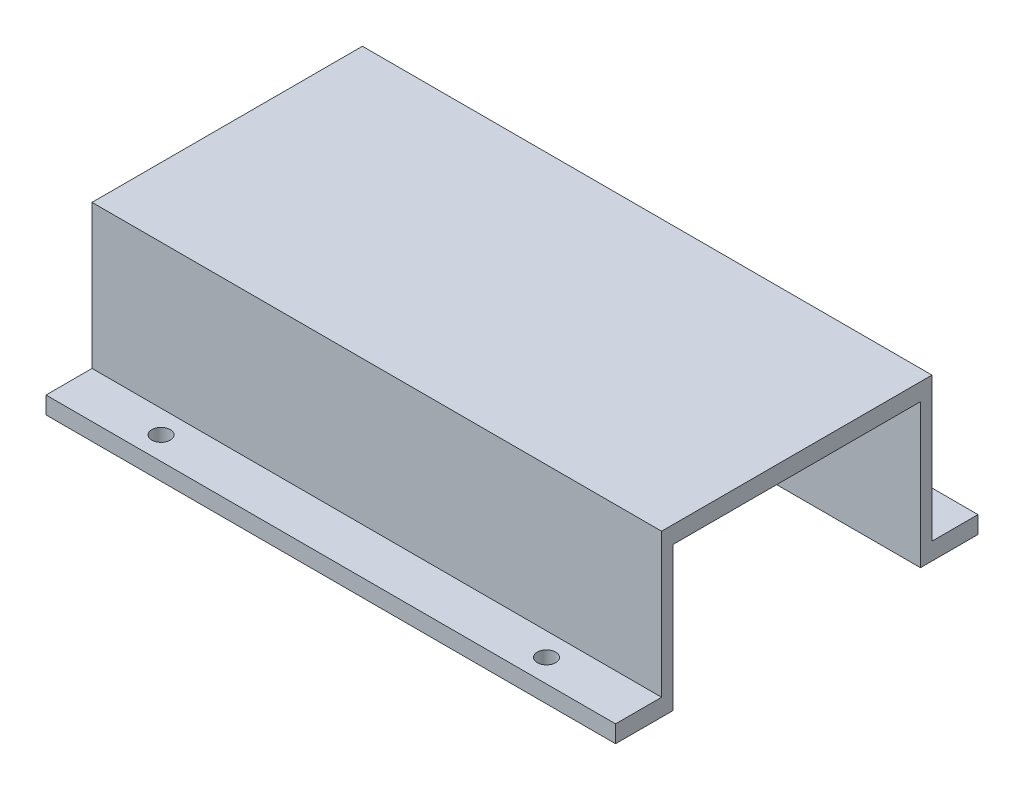
ISO-10303-21;
HEADER;
FILE_DESCRIPTION(('STEP AP214'),'2;1');
FILE_NAME('part.step','',(''),(''),'','','');
FILE_SCHEMA(('AUTOMOTIVE_DESIGN { 1 0 10303 214 1 1 1 1 }'));
ENDSEC;
DATA;
#1=APPLICATION_CONTEXT('core data for automotive mechanical design processes');
#2=APPLICATION_PROTOCOL_DEFINITION('international standard','automotive_design',2000,#1);
#3=PRODUCT_CONTEXT('',#1,'mechanical');
#4=PRODUCT('Part','Part','',(#3));
#5=PRODUCT_RELATED_PRODUCT_CATEGORY('part','',(#4));
#6=PRODUCT_DEFINITION_FORMATION('','',#4);
#7=PRODUCT_DEFINITION_CONTEXT('part definition',#1,'design');
#8=PRODUCT_DEFINITION('design','',#6,#7);
#9=PRODUCT_DEFINITION_SHAPE('','',#8);
#10=(LENGTH_UNIT() NAMED_UNIT(*) SI_UNIT(.MILLI.,.METRE.));
#11=(NAMED_UNIT(*) PLANE_ANGLE_UNIT() SI_UNIT($,.RADIAN.));
#12=(NAMED_UNIT(*) SI_UNIT($,.STERADIAN.) SOLID_ANGLE_UNIT());
#13=UNCERTAINTY_MEASURE_WITH_UNIT(LENGTH_MEASURE(1.E-05),#10,'distance_accuracy_value','');
#14=(GEOMETRIC_REPRESENTATION_CONTEXT(3) GLOBAL_UNCERTAINTY_ASSIGNED_CONTEXT((#13)) GLOBAL_UNIT_ASSIGNED_CONTEXT((#10,
#11,#12)) REPRESENTATION_CONTEXT('',''));
#15=CARTESIAN_POINT('',(0.,0.,0.));
#16=DIRECTION('',(0.,0.,1.));
#17=DIRECTION('',(1.,0.,0.));
#18=AXIS2_PLACEMENT_3D('',#15,#16,#17);
#19=CARTESIAN_POINT('',(0.,3.,23.5));
#20=DIRECTION('',(0.,0.,1.));
#21=DIRECTION('',(1.,0.,0.));
#22=AXIS2_PLACEMENT_3D('',#19,#20,#21);
#23=PLANE('',#22);
#24=DIRECTION('',(0.,-1.,0.));
#25=VECTOR('',#24,1.);
#26=CARTESIAN_POINT('',(-49.5,3.,23.5));
#27=LINE('',#26,#25);
#28=CARTESIAN_POINT('',(-49.5,3.,23.5));
#29=VERTEX_POINT('',#28);
#30=CARTESIAN_POINT('',(-49.5,-22.,23.5));
#31=VERTEX_POINT('',#30);
#32=EDGE_CURVE('E291',#29,#31,#27,.T.);
#33=ORIENTED_EDGE('',*,*,#32,.T.);
#34=DIRECTION('',(1.,0.,0.));
#35=VECTOR('',#34,1.);
#36=CARTESIAN_POINT('',(-49.5,-22.,23.5));
#37=LINE('',#36,#35);
#38=CARTESIAN_POINT('',(49.5,-22.,23.5));
#39=VERTEX_POINT('',#38);
#40=EDGE_CURVE('E212',#31,#39,#37,.T.);
#41=ORIENTED_EDGE('',*,*,#40,.T.);
#42=DIRECTION('',(0.,-1.,0.));
#43=VECTOR('',#42,1.);
#44=CARTESIAN_POINT('',(49.5,3.,23.5));
#45=LINE('',#44,#43);
#46=CARTESIAN_POINT('',(49.5,3.,23.5));
#47=VERTEX_POINT('',#46);
#48=EDGE_CURVE('E283',#47,#39,#45,.T.);
#49=ORIENTED_EDGE('',*,*,#48,.F.);
#50=DIRECTION('',(-1.,0.,0.));
#51=VECTOR('',#50,1.);
#52=CARTESIAN_POINT('',(0.,3.,23.5));
#53=LINE('',#52,#51);
#54=EDGE_CURVE('E279',#47,#29,#53,.T.);
#55=ORIENTED_EDGE('',*,*,#54,.T.);
#56=EDGE_LOOP('',(#33,#41,#49,#55));
#57=FACE_BOUND('',#56,.T.);
#58=ADVANCED_FACE('F43',(#57),#23,.T.);
#59=CARTESIAN_POINT('',(0.,0.,0.));
#60=DIRECTION('',(0.,1.,0.));
#61=DIRECTION('',(0.,0.,1.));
#62=AXIS2_PLACEMENT_3D('',#59,#60,#61);
#63=PLANE('',#62);
#64=DIRECTION('',(-1.,0.,0.));
#65=VECTOR('',#64,1.);
#66=CARTESIAN_POINT('',(0.,0.,-21.5));
#67=LINE('',#66,#65);
#68=CARTESIAN_POINT('',(49.5,0.,-21.5));
#69=VERTEX_POINT('',#68);
#70=CARTESIAN_POINT('',(-49.5,0.,-21.5));
#71=VERTEX_POINT('',#70);
#72=EDGE_CURVE('E146',#69,#71,#67,.T.);
#73=ORIENTED_EDGE('',*,*,#72,.F.);
#74=DIRECTION('',(0.,0.,1.));
#75=VECTOR('',#74,1.);
#76=CARTESIAN_POINT('',(49.5,0.,0.));
#77=LINE('',#76,#75);
#78=CARTESIAN_POINT('',(49.5,0.,21.5));
#79=VERTEX_POINT('',#78);
#80=EDGE_CURVE('E264',#69,#79,#77,.T.);
#81=ORIENTED_EDGE('',*,*,#80,.T.);
#82=DIRECTION('',(-1.,0.,0.));
#83=VECTOR('',#82,1.);
#84=CARTESIAN_POINT('',(0.,0.,21.5));
#85=LINE('',#84,#83);
#86=CARTESIAN_POINT('',(-49.5,0.,21.5));
#87=VERTEX_POINT('',#86);
#88=EDGE_CURVE('E243',#79,#87,#85,.T.);
#89=ORIENTED_EDGE('',*,*,#88,.T.);
#90=DIRECTION('',(0.,0.,1.));
#91=VECTOR('',#90,1.);
#92=CARTESIAN_POINT('',(-49.5,0.,0.));
#93=LINE('',#92,#91);
#94=EDGE_CURVE('E273',#71,#87,#93,.T.);
#95=ORIENTED_EDGE('',*,*,#94,.F.);
#96=EDGE_LOOP('',(#73,#81,#89,#95));
#97=FACE_BOUND('',#96,.T.);
#98=ADVANCED_FACE('F327',(#97),#63,.F.);
#99=CARTESIAN_POINT('',(49.5,3.,0.));
#100=DIRECTION('',(1.,0.,0.));
#101=DIRECTION('',(0.,0.,-1.));
#102=AXIS2_PLACEMENT_3D('',#99,#100,#101);
#103=PLANE('',#102);
#104=ORIENTED_EDGE('',*,*,#80,.F.);
#105=DIRECTION('',(0.,1.,0.));
#106=VECTOR('',#105,1.);
#107=CARTESIAN_POINT('',(49.5,-25.,-21.5));
#108=LINE('',#107,#106);
#109=CARTESIAN_POINT('',(49.5,-25.,-21.5));
#110=VERTEX_POINT('',#109);
#111=EDGE_CURVE('E141',#110,#69,#108,.T.);
#112=ORIENTED_EDGE('',*,*,#111,.F.);
#113=DIRECTION('',(0.,0.,1.));
#114=VECTOR('',#113,1.);
#115=CARTESIAN_POINT('',(49.5,-25.,0.));
#116=LINE('',#115,#114);
#117=CARTESIAN_POINT('',(49.5,-25.,-31.5));
#118=VERTEX_POINT('',#117);
#119=EDGE_CURVE('E136',#118,#110,#116,.T.);
#120=ORIENTED_EDGE('',*,*,#119,.F.);
#121=DIRECTION('',(0.,-1.,0.));
#122=VECTOR('',#121,1.);
#123=CARTESIAN_POINT('',(49.5,-22.,-31.5));
#124=LINE('',#123,#122);
#125=CARTESIAN_POINT('',(49.5,-22.,-31.5));
#126=VERTEX_POINT('',#125);
#127=EDGE_CURVE('E139',#126,#118,#124,.T.);
#128=ORIENTED_EDGE('',*,*,#127,.F.);
#129=DIRECTION('',(0.,0.,1.));
#130=VECTOR('',#129,1.);
#131=CARTESIAN_POINT('',(49.5,-22.,-31.5));
#132=LINE('',#131,#130);
#133=CARTESIAN_POINT('',(49.5,-22.,-23.5));
#134=VERTEX_POINT('',#133);
#135=EDGE_CURVE('E175',#126,#134,#132,.T.);
#136=ORIENTED_EDGE('',*,*,#135,.T.);
#137=DIRECTION('',(0.,-1.,0.));
#138=VECTOR('',#137,1.);
#139=CARTESIAN_POINT('',(49.5,3.,-23.5));
#140=LINE('',#139,#138);
#141=CARTESIAN_POINT('',(49.5,3.,-23.5));
#142=VERTEX_POINT('',#141);
#143=EDGE_CURVE('E11',#142,#134,#140,.T.);
#144=ORIENTED_EDGE('',*,*,#143,.F.);
#145=DIRECTION('',(0.,0.,1.));
#146=VECTOR('',#145,1.);
#147=CARTESIAN_POINT('',(49.5,3.,0.));
#148=LINE('',#147,#146);
#149=EDGE_CURVE('E268',#142,#47,#148,.T.);
#150=ORIENTED_EDGE('',*,*,#149,.T.);
#151=ORIENTED_EDGE('',*,*,#48,.T.);
#152=DIRECTION('',(0.,0.,1.));
#153=VECTOR('',#152,1.);
#154=CARTESIAN_POINT('',(49.5,-22.,31.5));
#155=LINE('',#154,#153);
#156=CARTESIAN_POINT('',(49.5,-22.,31.5));
#157=VERTEX_POINT('',#156);
#158=EDGE_CURVE('E67',#39,#157,#155,.T.);
#159=ORIENTED_EDGE('',*,*,#158,.T.);
#160=DIRECTION('',(0.,-1.,0.));
#161=VECTOR('',#160,1.);
#162=CARTESIAN_POINT('',(49.5,-22.,31.5));
#163=LINE('',#162,#161);
#164=CARTESIAN_POINT('',(49.5,-25.,31.5));
#165=VERTEX_POINT('',#164);
#166=EDGE_CURVE('E221',#157,#165,#163,.T.);
#167=ORIENTED_EDGE('',*,*,#166,.T.);
#168=DIRECTION('',(0.,0.,1.));
#169=VECTOR('',#168,1.);
#170=CARTESIAN_POINT('',(49.5,-25.,0.));
#171=LINE('',#170,#169);
#172=CARTESIAN_POINT('',(49.5,-25.,21.5));
#173=VERTEX_POINT('',#172);
#174=EDGE_CURVE('E246',#173,#165,#171,.T.);
#175=ORIENTED_EDGE('',*,*,#174,.F.);
#176=DIRECTION('',(0.,1.,0.));
#177=VECTOR('',#176,1.);
#178=CARTESIAN_POINT('',(49.5,-25.,21.5));
#179=LINE('',#178,#177);
#180=EDGE_CURVE('E256',#173,#79,#179,.T.);
#181=ORIENTED_EDGE('',*,*,#180,.T.);
#182=EDGE_LOOP('',(#104,#112,#120,#128,#136,#144,#150,#151,#159,#167,#175,#181));
#183=FACE_BOUND('',#182,.T.);
#184=ADVANCED_FACE('F45',(#183),#103,.T.);
#185=CARTESIAN_POINT('',(0.,3.,-23.5));
#186=DIRECTION('',(0.,0.,1.));
#187=DIRECTION('',(1.,0.,0.));
#188=AXIS2_PLACEMENT_3D('',#185,#186,#187);
#189=PLANE('',#188);
#190=ORIENTED_EDGE('',*,*,#143,.T.);
#191=DIRECTION('',(-1.,0.,0.));
#192=VECTOR('',#191,1.);
#193=CARTESIAN_POINT('',(-49.5,-22.,-23.5));
#194=LINE('',#193,#192);
#195=CARTESIAN_POINT('',(-49.5,-22.,-23.5));
#196=VERTEX_POINT('',#195);
#197=EDGE_CURVE('E172',#134,#196,#194,.T.);
#198=ORIENTED_EDGE('',*,*,#197,.T.);
#199=DIRECTION('',(0.,-1.,0.));
#200=VECTOR('',#199,1.);
#201=CARTESIAN_POINT('',(-49.5,3.,-23.5));
#202=LINE('',#201,#200);
#203=CARTESIAN_POINT('',(-49.5,3.,-23.5));
#204=VERTEX_POINT('',#203);
#205=EDGE_CURVE('E52',#204,#196,#202,.T.);
#206=ORIENTED_EDGE('',*,*,#205,.F.);
#207=DIRECTION('',(-1.,0.,0.));
#208=VECTOR('',#207,1.);
#209=CARTESIAN_POINT('',(0.,3.,-23.5));
#210=LINE('',#209,#208);
#211=EDGE_CURVE('E272',#142,#204,#210,.T.);
#212=ORIENTED_EDGE('',*,*,#211,.F.);
#213=EDGE_LOOP('',(#190,#198,#206,#212));
#214=FACE_BOUND('',#213,.T.);
#215=ADVANCED_FACE('F303',(#214),#189,.F.);
#216=CARTESIAN_POINT('',(-49.5,3.,0.));
#217=DIRECTION('',(1.,0.,0.));
#218=DIRECTION('',(0.,0.,-1.));
#219=AXIS2_PLACEMENT_3D('',#216,#217,#218);
#220=PLANE('',#219);
#221=ORIENTED_EDGE('',*,*,#205,.T.);
#222=DIRECTION('',(0.,0.,-1.));
#223=VECTOR('',#222,1.);
#224=CARTESIAN_POINT('',(-49.5,-22.,-31.5));
#225=LINE('',#224,#223);
#226=CARTESIAN_POINT('',(-49.5,-22.,-31.5));
#227=VERTEX_POINT('',#226);
#228=EDGE_CURVE('E59',#196,#227,#225,.T.);
#229=ORIENTED_EDGE('',*,*,#228,.T.);
#230=DIRECTION('',(0.,-1.,0.));
#231=VECTOR('',#230,1.);
#232=CARTESIAN_POINT('',(-49.5,-22.,-31.5));
#233=LINE('',#232,#231);
#234=CARTESIAN_POINT('',(-49.5,-25.,-31.5));
#235=VERTEX_POINT('',#234);
#236=EDGE_CURVE('E155',#227,#235,#233,.T.);
#237=ORIENTED_EDGE('',*,*,#236,.T.);
#238=DIRECTION('',(0.,0.,1.));
#239=VECTOR('',#238,1.);
#240=CARTESIAN_POINT('',(-49.4999999999999,-25.,1.71737624121704E-13));
#241=LINE('',#240,#239);
#242=CARTESIAN_POINT('',(-49.5,-25.,-21.5));
#243=VERTEX_POINT('',#242);
#244=EDGE_CURVE('E145',#235,#243,#241,.T.);
#245=ORIENTED_EDGE('',*,*,#244,.T.);
#246=DIRECTION('',(0.,1.,0.));
#247=VECTOR('',#246,1.);
#248=CARTESIAN_POINT('',(-49.5,-25.,-21.5));
#249=LINE('',#248,#247);
#250=EDGE_CURVE('E237',#243,#71,#249,.T.);
#251=ORIENTED_EDGE('',*,*,#250,.T.);
#252=ORIENTED_EDGE('',*,*,#94,.T.);
#253=DIRECTION('',(0.,1.,0.));
#254=VECTOR('',#253,1.);
#255=CARTESIAN_POINT('',(-49.5,-25.,21.5));
#256=LINE('',#255,#254);
#257=CARTESIAN_POINT('',(-49.5,-25.,21.5));
#258=VERTEX_POINT('',#257);
#259=EDGE_CURVE('E260',#258,#87,#256,.T.);
#260=ORIENTED_EDGE('',*,*,#259,.F.);
#261=DIRECTION('',(0.,0.,1.));
#262=VECTOR('',#261,1.);
#263=CARTESIAN_POINT('',(-49.5,-25.,0.));
#264=LINE('',#263,#262);
#265=CARTESIAN_POINT('',(-49.5,-25.,31.5));
#266=VERTEX_POINT('',#265);
#267=EDGE_CURVE('E253',#258,#266,#264,.T.);
#268=ORIENTED_EDGE('',*,*,#267,.T.);
#269=DIRECTION('',(0.,-1.,0.));
#270=VECTOR('',#269,1.);
#271=CARTESIAN_POINT('',(-49.5,-22.,31.5));
#272=LINE('',#271,#270);
#273=CARTESIAN_POINT('',(-49.5,-22.,31.5));
#274=VERTEX_POINT('',#273);
#275=EDGE_CURVE('E225',#274,#266,#272,.T.);
#276=ORIENTED_EDGE('',*,*,#275,.F.);
#277=DIRECTION('',(0.,0.,-1.));
#278=VECTOR('',#277,1.);
#279=CARTESIAN_POINT('',(-49.5,-22.,31.5));
#280=LINE('',#279,#278);
#281=EDGE_CURVE('E208',#274,#31,#280,.T.);
#282=ORIENTED_EDGE('',*,*,#281,.T.);
#283=ORIENTED_EDGE('',*,*,#32,.F.);
#284=DIRECTION('',(0.,0.,1.));
#285=VECTOR('',#284,1.);
#286=CARTESIAN_POINT('',(-49.5,3.,0.));
#287=LINE('',#286,#285);
#288=EDGE_CURVE('E276',#204,#29,#287,.T.);
#289=ORIENTED_EDGE('',*,*,#288,.F.);
#290=EDGE_LOOP('',(#221,#229,#237,#245,#251,#252,#260,#268,#276,#282,#283,#289));
#291=FACE_BOUND('',#290,.T.);
#292=ADVANCED_FACE('F299',(#291),#220,.F.);
#293=CARTESIAN_POINT('',(0.,3.,0.));
#294=DIRECTION('',(0.,1.,0.));
#295=DIRECTION('',(0.,0.,1.));
#296=AXIS2_PLACEMENT_3D('',#293,#294,#295);
#297=PLANE('',#296);
#298=ORIENTED_EDGE('',*,*,#149,.F.);
#299=ORIENTED_EDGE('',*,*,#211,.T.);
#300=ORIENTED_EDGE('',*,*,#288,.T.);
#301=ORIENTED_EDGE('',*,*,#54,.F.);
#302=EDGE_LOOP('',(#298,#299,#300,#301));
#303=FACE_BOUND('',#302,.T.);
#304=ADVANCED_FACE('F308',(#303),#297,.T.);
#305=CARTESIAN_POINT('',(0.,-25.,21.5));
#306=DIRECTION('',(0.,0.,-1.));
#307=DIRECTION('',(-1.,0.,0.));
#308=AXIS2_PLACEMENT_3D('',#305,#306,#307);
#309=PLANE('',#308);
#310=ORIENTED_EDGE('',*,*,#88,.F.);
#311=ORIENTED_EDGE('',*,*,#180,.F.);
#312=DIRECTION('',(-1.,0.,0.));
#313=VECTOR('',#312,1.);
#314=CARTESIAN_POINT('',(0.,-25.,21.5));
#315=LINE('',#314,#313);
#316=EDGE_CURVE('E249',#173,#258,#315,.T.);
#317=ORIENTED_EDGE('',*,*,#316,.T.);
#318=ORIENTED_EDGE('',*,*,#259,.T.);
#319=EDGE_LOOP('',(#310,#311,#317,#318));
#320=FACE_BOUND('',#319,.T.);
#321=ADVANCED_FACE('F323',(#320),#309,.T.);
#322=CARTESIAN_POINT('',(0.,-25.,0.));
#323=DIRECTION('',(0.,1.,0.));
#324=DIRECTION('',(0.,0.,1.));
#325=AXIS2_PLACEMENT_3D('',#322,#323,#324);
#326=PLANE('',#325);
#327=ORIENTED_EDGE('',*,*,#174,.T.);
#328=DIRECTION('',(-1.,0.,0.));
#329=VECTOR('',#328,1.);
#330=CARTESIAN_POINT('',(-49.5,-25.,31.5));
#331=LINE('',#330,#329);
#332=EDGE_CURVE('E204',#165,#266,#331,.T.);
#333=ORIENTED_EDGE('',*,*,#332,.T.);
#334=ORIENTED_EDGE('',*,*,#267,.F.);
#335=ORIENTED_EDGE('',*,*,#316,.F.);
#336=EDGE_LOOP('',(#327,#333,#334,#335));
#337=FACE_BOUND('',#336,.T.);
#338=CARTESIAN_POINT('',(33.5,-25.,27.5));
#339=DIRECTION('',(0.,-1.,0.));
#340=DIRECTION('',(0.,0.,1.));
#341=AXIS2_PLACEMENT_3D('',#338,#339,#340);
#342=CIRCLE('',#341,1.6);
#343=CARTESIAN_POINT('',(33.5,-25.,29.1));
#344=VERTEX_POINT('',#343);
#345=EDGE_CURVE('E188',#344,#344,#342,.T.);
#346=ORIENTED_EDGE('',*,*,#345,.F.);
#347=EDGE_LOOP('',(#346));
#348=FACE_BOUND('',#347,.T.);
#349=CARTESIAN_POINT('',(-33.5,-25.,27.5));
#350=DIRECTION('',(0.,-1.,0.));
#351=DIRECTION('',(0.,0.,-1.));
#352=AXIS2_PLACEMENT_3D('',#349,#350,#351);
#353=CIRCLE('',#352,1.6);
#354=CARTESIAN_POINT('',(-33.5,-25.,25.9));
#355=VERTEX_POINT('',#354);
#356=EDGE_CURVE('E196',#355,#355,#353,.T.);
#357=ORIENTED_EDGE('',*,*,#356,.F.);
#358=EDGE_LOOP('',(#357));
#359=FACE_BOUND('',#358,.T.);
#360=ADVANCED_FACE('F317',(#337,#348,#359),#326,.F.);
#361=CARTESIAN_POINT('',(0.,-25.,-21.5));
#362=DIRECTION('',(0.,0.,-1.));
#363=DIRECTION('',(-1.,0.,0.));
#364=AXIS2_PLACEMENT_3D('',#361,#362,#363);
#365=PLANE('',#364);
#366=ORIENTED_EDGE('',*,*,#72,.T.);
#367=ORIENTED_EDGE('',*,*,#250,.F.);
#368=DIRECTION('',(-1.,0.,0.));
#369=VECTOR('',#368,1.);
#370=CARTESIAN_POINT('',(0.,-25.,-21.5));
#371=LINE('',#370,#369);
#372=EDGE_CURVE('E234',#110,#243,#371,.T.);
#373=ORIENTED_EDGE('',*,*,#372,.F.);
#374=ORIENTED_EDGE('',*,*,#111,.T.);
#375=EDGE_LOOP('',(#366,#367,#373,#374));
#376=FACE_BOUND('',#375,.T.);
#377=ADVANCED_FACE('F330',(#376),#365,.F.);
#378=CARTESIAN_POINT('',(0.,-25.,0.));
#379=DIRECTION('',(0.,1.,0.));
#380=DIRECTION('',(0.,0.,1.));
#381=AXIS2_PLACEMENT_3D('',#378,#379,#380);
#382=PLANE('',#381);
#383=ORIENTED_EDGE('',*,*,#119,.T.);
#384=ORIENTED_EDGE('',*,*,#372,.T.);
#385=ORIENTED_EDGE('',*,*,#244,.F.);
#386=DIRECTION('',(1.,0.,0.));
#387=VECTOR('',#386,1.);
#388=CARTESIAN_POINT('',(-49.5,-25.,-31.5));
#389=LINE('',#388,#387);
#390=EDGE_CURVE('E152',#235,#118,#389,.T.);
#391=ORIENTED_EDGE('',*,*,#390,.T.);
#392=EDGE_LOOP('',(#383,#384,#385,#391));
#393=FACE_BOUND('',#392,.T.);
#394=CARTESIAN_POINT('',(-33.5,-25.,-27.5));
#395=DIRECTION('',(0.,-1.,0.));
#396=DIRECTION('',(0.,0.,1.));
#397=AXIS2_PLACEMENT_3D('',#394,#395,#396);
#398=CIRCLE('',#397,1.6);
#399=CARTESIAN_POINT('',(-33.5,-25.,-25.9));
#400=VERTEX_POINT('',#399);
#401=EDGE_CURVE('E184',#400,#400,#398,.T.);
#402=ORIENTED_EDGE('',*,*,#401,.F.);
#403=EDGE_LOOP('',(#402));
#404=FACE_BOUND('',#403,.T.);
#405=CARTESIAN_POINT('',(33.5,-25.,-27.5));
#406=DIRECTION('',(0.,-1.,0.));
#407=DIRECTION('',(0.,0.,-1.));
#408=AXIS2_PLACEMENT_3D('',#405,#406,#407);
#409=CIRCLE('',#408,1.6);
#410=CARTESIAN_POINT('',(33.5,-25.,-29.1));
#411=VERTEX_POINT('',#410);
#412=EDGE_CURVE('E167',#411,#411,#409,.T.);
#413=ORIENTED_EDGE('',*,*,#412,.F.);
#414=EDGE_LOOP('',(#413));
#415=FACE_BOUND('',#414,.T.);
#416=ADVANCED_FACE('F157',(#393,#404,#415),#382,.F.);
#417=CARTESIAN_POINT('',(-49.5,-22.,31.5));
#418=DIRECTION('',(0.,0.,1.));
#419=DIRECTION('',(1.,0.,0.));
#420=AXIS2_PLACEMENT_3D('',#417,#418,#419);
#421=PLANE('',#420);
#422=ORIENTED_EDGE('',*,*,#332,.F.);
#423=ORIENTED_EDGE('',*,*,#166,.F.);
#424=DIRECTION('',(-1.,0.,0.));
#425=VECTOR('',#424,1.);
#426=CARTESIAN_POINT('',(-49.5,-22.,31.5));
#427=LINE('',#426,#425);
#428=EDGE_CURVE('E217',#157,#274,#427,.T.);
#429=ORIENTED_EDGE('',*,*,#428,.T.);
#430=ORIENTED_EDGE('',*,*,#275,.T.);
#431=EDGE_LOOP('',(#422,#423,#429,#430));
#432=FACE_BOUND('',#431,.T.);
#433=ADVANCED_FACE('F315',(#432),#421,.T.);
#434=CARTESIAN_POINT('',(0.,-22.,0.));
#435=DIRECTION('',(0.,-1.,0.));
#436=DIRECTION('',(0.,0.,-1.));
#437=AXIS2_PLACEMENT_3D('',#434,#435,#436);
#438=PLANE('',#437);
#439=CARTESIAN_POINT('',(33.5,-22.,27.5));
#440=DIRECTION('',(0.,-1.,0.));
#441=DIRECTION('',(0.,0.,1.));
#442=AXIS2_PLACEMENT_3D('',#439,#440,#441);
#443=CIRCLE('',#442,1.6);
#444=CARTESIAN_POINT('',(33.5,-22.,29.1));
#445=VERTEX_POINT('',#444);
#446=EDGE_CURVE('E192',#445,#445,#443,.T.);
#447=ORIENTED_EDGE('',*,*,#446,.T.);
#448=EDGE_LOOP('',(#447));
#449=FACE_BOUND('',#448,.T.);
#450=CARTESIAN_POINT('',(-33.5,-22.,27.5));
#451=DIRECTION('',(0.,-1.,0.));
#452=DIRECTION('',(0.,0.,-1.));
#453=AXIS2_PLACEMENT_3D('',#450,#451,#452);
#454=CIRCLE('',#453,1.6);
#455=CARTESIAN_POINT('',(-33.5,-22.,25.9));
#456=VERTEX_POINT('',#455);
#457=EDGE_CURVE('E200',#456,#456,#454,.T.);
#458=ORIENTED_EDGE('',*,*,#457,.T.);
#459=EDGE_LOOP('',(#458));
#460=FACE_BOUND('',#459,.T.);
#461=ORIENTED_EDGE('',*,*,#281,.F.);
#462=ORIENTED_EDGE('',*,*,#428,.F.);
#463=ORIENTED_EDGE('',*,*,#158,.F.);
#464=ORIENTED_EDGE('',*,*,#40,.F.);
#465=EDGE_LOOP('',(#461,#462,#463,#464));
#466=FACE_BOUND('',#465,.T.);
#467=ADVANCED_FACE('F311',(#449,#460,#466),#438,.F.);
#468=CARTESIAN_POINT('',(-33.5,-22.,27.5));
#469=DIRECTION('',(0.,-1.,0.));
#470=DIRECTION('',(0.,0.,-1.));
#471=AXIS2_PLACEMENT_3D('',#468,#469,#470);
#472=CYLINDRICAL_SURFACE('',#471,1.6);
#473=ORIENTED_EDGE('',*,*,#457,.F.);
#474=EDGE_LOOP('',(#473));
#475=FACE_BOUND('',#474,.T.);
#476=ORIENTED_EDGE('',*,*,#356,.T.);
#477=EDGE_LOOP('',(#476));
#478=FACE_BOUND('',#477,.T.);
#479=ADVANCED_FACE('F409',(#475,#478),#472,.F.);
#480=CARTESIAN_POINT('',(33.5,-22.,27.5));
#481=DIRECTION('',(0.,-1.,0.));
#482=DIRECTION('',(0.,0.,-1.));
#483=AXIS2_PLACEMENT_3D('',#480,#481,#482);
#484=CYLINDRICAL_SURFACE('',#483,1.6);
#485=ORIENTED_EDGE('',*,*,#446,.F.);
#486=EDGE_LOOP('',(#485));
#487=FACE_BOUND('',#486,.T.);
#488=ORIENTED_EDGE('',*,*,#345,.T.);
#489=EDGE_LOOP('',(#488));
#490=FACE_BOUND('',#489,.T.);
#491=ADVANCED_FACE('F419',(#487,#490),#484,.F.);
#492=CARTESIAN_POINT('',(-49.5,-22.,-31.5));
#493=DIRECTION('',(0.,0.,-1.));
#494=DIRECTION('',(-1.,0.,0.));
#495=AXIS2_PLACEMENT_3D('',#492,#493,#494);
#496=PLANE('',#495);
#497=ORIENTED_EDGE('',*,*,#390,.F.);
#498=ORIENTED_EDGE('',*,*,#236,.F.);
#499=DIRECTION('',(1.,0.,0.));
#500=VECTOR('',#499,1.);
#501=CARTESIAN_POINT('',(-49.5,-22.,-31.5));
#502=LINE('',#501,#500);
#503=EDGE_CURVE('E153',#227,#126,#502,.T.);
#504=ORIENTED_EDGE('',*,*,#503,.T.);
#505=ORIENTED_EDGE('',*,*,#127,.T.);
#506=EDGE_LOOP('',(#497,#498,#504,#505));
#507=FACE_BOUND('',#506,.T.);
#508=ADVANCED_FACE('F151',(#507),#496,.T.);
#509=CARTESIAN_POINT('',(0.,-22.,0.));
#510=DIRECTION('',(0.,1.,0.));
#511=DIRECTION('',(0.,0.,1.));
#512=AXIS2_PLACEMENT_3D('',#509,#510,#511);
#513=PLANE('',#512);
#514=CARTESIAN_POINT('',(-33.5,-22.,-27.5));
#515=DIRECTION('',(0.,-1.,0.));
#516=DIRECTION('',(0.,0.,1.));
#517=AXIS2_PLACEMENT_3D('',#514,#515,#516);
#518=CIRCLE('',#517,1.6);
#519=CARTESIAN_POINT('',(-33.5,-22.,-25.9));
#520=VERTEX_POINT('',#519);
#521=EDGE_CURVE('E182',#520,#520,#518,.T.);
#522=ORIENTED_EDGE('',*,*,#521,.T.);
#523=EDGE_LOOP('',(#522));
#524=FACE_BOUND('',#523,.T.);
#525=CARTESIAN_POINT('',(33.5,-22.,-27.5));
#526=DIRECTION('',(0.,-1.,0.));
#527=DIRECTION('',(0.,0.,-1.));
#528=AXIS2_PLACEMENT_3D('',#525,#526,#527);
#529=CIRCLE('',#528,1.6);
#530=CARTESIAN_POINT('',(33.5,-22.,-29.1));
#531=VERTEX_POINT('',#530);
#532=EDGE_CURVE('E162',#531,#531,#529,.T.);
#533=ORIENTED_EDGE('',*,*,#532,.T.);
#534=EDGE_LOOP('',(#533));
#535=FACE_BOUND('',#534,.T.);
#536=ORIENTED_EDGE('',*,*,#228,.F.);
#537=ORIENTED_EDGE('',*,*,#197,.F.);
#538=ORIENTED_EDGE('',*,*,#135,.F.);
#539=ORIENTED_EDGE('',*,*,#503,.F.);
#540=EDGE_LOOP('',(#536,#537,#538,#539));
#541=FACE_BOUND('',#540,.T.);
#542=ADVANCED_FACE('F305',(#524,#535,#541),#513,.T.);
#543=CARTESIAN_POINT('',(33.5,-22.,-27.5));
#544=DIRECTION('',(0.,-1.,0.));
#545=DIRECTION('',(0.,0.,-1.));
#546=AXIS2_PLACEMENT_3D('',#543,#544,#545);
#547=CYLINDRICAL_SURFACE('',#546,1.6);
#548=ORIENTED_EDGE('',*,*,#532,.F.);
#549=EDGE_LOOP('',(#548));
#550=FACE_BOUND('',#549,.T.);
#551=ORIENTED_EDGE('',*,*,#412,.T.);
#552=EDGE_LOOP('',(#551));
#553=FACE_BOUND('',#552,.T.);
#554=ADVANCED_FACE('F446',(#550,#553),#547,.F.);
#555=CARTESIAN_POINT('',(-33.5,-22.,-27.5));
#556=DIRECTION('',(0.,-1.,0.));
#557=DIRECTION('',(0.,0.,-1.));
#558=AXIS2_PLACEMENT_3D('',#555,#556,#557);
#559=CYLINDRICAL_SURFACE('',#558,1.6);
#560=ORIENTED_EDGE('',*,*,#521,.F.);
#561=EDGE_LOOP('',(#560));
#562=FACE_BOUND('',#561,.T.);
#563=ORIENTED_EDGE('',*,*,#401,.T.);
#564=EDGE_LOOP('',(#563));
#565=FACE_BOUND('',#564,.T.);
#566=ADVANCED_FACE('F456',(#562,#565),#559,.F.);
#567=CLOSED_SHELL('',(#58,#98,#184,#215,#292,#304,#321,#360,#377,#416,#433,#467,#479,#491,#508,
#542,#554,#566));
#568=MANIFOLD_SOLID_BREP('B2',#567);
#569=ADVANCED_BREP_SHAPE_REPRESENTATION('',(#18,#568),#14);
#570=SHAPE_DEFINITION_REPRESENTATION(#9,#569);
ENDSEC;
END-ISO-10303-21;
